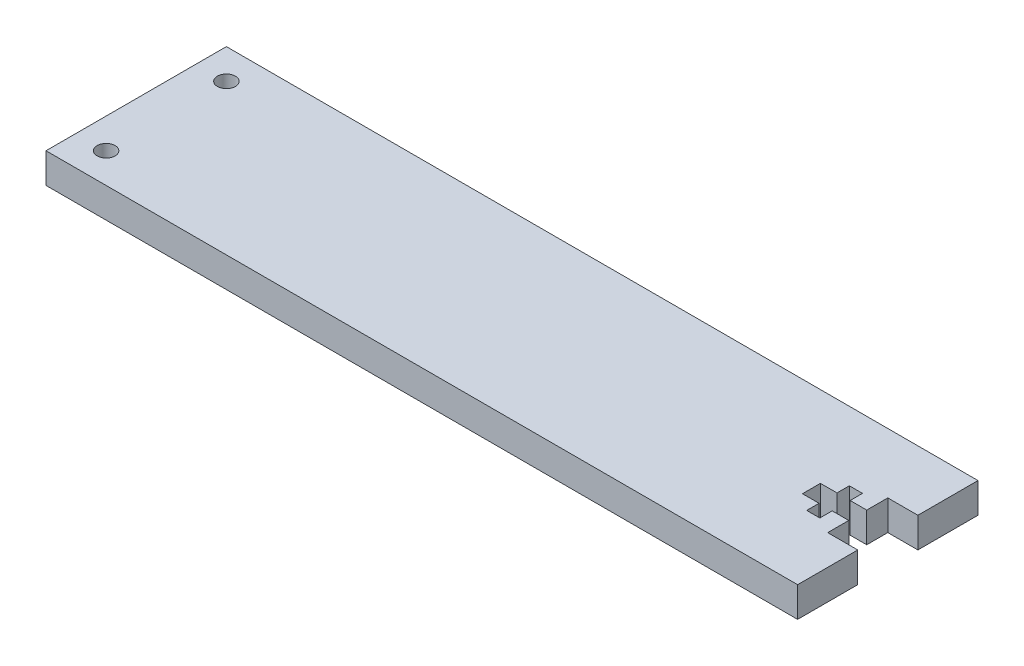
ISO-10303-21;
HEADER;
FILE_DESCRIPTION(('STEP AP214'),'2;1');
FILE_NAME('part.step','',(''),(''),'','','');
FILE_SCHEMA(('AUTOMOTIVE_DESIGN { 1 0 10303 214 1 1 1 1 }'));
ENDSEC;
DATA;
#1=APPLICATION_CONTEXT('core data for automotive mechanical design processes');
#2=APPLICATION_PROTOCOL_DEFINITION('international standard','automotive_design',2000,#1);
#3=PRODUCT_CONTEXT('',#1,'mechanical');
#4=PRODUCT('Part','Part','',(#3));
#5=PRODUCT_RELATED_PRODUCT_CATEGORY('part','',(#4));
#6=PRODUCT_DEFINITION_FORMATION('','',#4);
#7=PRODUCT_DEFINITION_CONTEXT('part definition',#1,'design');
#8=PRODUCT_DEFINITION('design','',#6,#7);
#9=PRODUCT_DEFINITION_SHAPE('','',#8);
#10=(LENGTH_UNIT() NAMED_UNIT(*) SI_UNIT(.MILLI.,.METRE.));
#11=(NAMED_UNIT(*) PLANE_ANGLE_UNIT() SI_UNIT($,.RADIAN.));
#12=(NAMED_UNIT(*) SI_UNIT($,.STERADIAN.) SOLID_ANGLE_UNIT());
#13=UNCERTAINTY_MEASURE_WITH_UNIT(LENGTH_MEASURE(1.E-05),#10,'distance_accuracy_value','');
#14=(GEOMETRIC_REPRESENTATION_CONTEXT(3) GLOBAL_UNCERTAINTY_ASSIGNED_CONTEXT((#13)) GLOBAL_UNIT_ASSIGNED_CONTEXT((#10,
#11,#12)) REPRESENTATION_CONTEXT('',''));
#15=CARTESIAN_POINT('',(0.,0.,0.));
#16=DIRECTION('',(0.,0.,1.));
#17=DIRECTION('',(1.,0.,0.));
#18=AXIS2_PLACEMENT_3D('',#15,#16,#17);
#19=CARTESIAN_POINT('',(0.,3.175,0.));
#20=DIRECTION('',(0.,-1.,0.));
#21=DIRECTION('',(0.,0.,-1.));
#22=AXIS2_PLACEMENT_3D('',#19,#20,#21);
#23=PLANE('',#22);
#24=CARTESIAN_POINT('',(-73.025,3.175,12.7));
#25=DIRECTION('',(0.,1.,0.));
#26=DIRECTION('',(0.,0.,1.));
#27=AXIS2_PLACEMENT_3D('',#24,#25,#26);
#28=CIRCLE('',#27,1.89864999999999);
#29=CARTESIAN_POINT('',(-73.025,3.175,14.59865));
#30=VERTEX_POINT('',#29);
#31=EDGE_CURVE('E600',#30,#30,#28,.T.);
#32=ORIENTED_EDGE('',*,*,#31,.F.);
#33=EDGE_LOOP('',(#32));
#34=FACE_BOUND('',#33,.T.);
#35=DIRECTION('',(0.,0.,-1.));
#36=VECTOR('',#35,1.);
#37=CARTESIAN_POINT('',(79.375,3.175,19.05));
#38=LINE('',#37,#36);
#39=CARTESIAN_POINT('',(79.375,3.175,19.05));
#40=VERTEX_POINT('',#39);
#41=CARTESIAN_POINT('',(79.375,3.175,6.35));
#42=VERTEX_POINT('',#41);
#43=EDGE_CURVE('E252',#40,#42,#38,.T.);
#44=ORIENTED_EDGE('',*,*,#43,.T.);
#45=DIRECTION('',(1.,0.,0.));
#46=VECTOR('',#45,1.);
#47=CARTESIAN_POINT('',(79.375,3.175,6.35));
#48=LINE('',#47,#46);
#49=CARTESIAN_POINT('',(73.025,3.175,6.35));
#50=VERTEX_POINT('',#49);
#51=EDGE_CURVE('E195',#50,#42,#48,.T.);
#52=ORIENTED_EDGE('',*,*,#51,.F.);
#53=DIRECTION('',(0.,0.,1.));
#54=VECTOR('',#53,1.);
#55=CARTESIAN_POINT('',(73.025,3.175,6.35));
#56=LINE('',#55,#54);
#57=CARTESIAN_POINT('',(73.025,3.175,1.89865));
#58=VERTEX_POINT('',#57);
#59=EDGE_CURVE('E200',#58,#50,#56,.T.);
#60=ORIENTED_EDGE('',*,*,#59,.F.);
#61=DIRECTION('',(1.,0.,0.));
#62=VECTOR('',#61,1.);
#63=CARTESIAN_POINT('',(73.025,3.175,1.89865));
#64=LINE('',#63,#62);
#65=CARTESIAN_POINT('',(69.524626,3.175,1.89865));
#66=VERTEX_POINT('',#65);
#67=EDGE_CURVE('E298',#66,#58,#64,.T.);
#68=ORIENTED_EDGE('',*,*,#67,.F.);
#69=DIRECTION('',(0.,0.,-1.));
#70=VECTOR('',#69,1.);
#71=CARTESIAN_POINT('',(69.524626,3.175,1.89865));
#72=LINE('',#71,#70);
#73=CARTESIAN_POINT('',(69.524626,3.175,4.50454662217654));
#74=VERTEX_POINT('',#73);
#75=EDGE_CURVE('E295',#74,#66,#72,.T.);
#76=ORIENTED_EDGE('',*,*,#75,.F.);
#77=DIRECTION('',(1.,0.,0.));
#78=VECTOR('',#77,1.);
#79=CARTESIAN_POINT('',(69.524626,3.175,4.50454662217654));
#80=LINE('',#79,#78);
#81=CARTESIAN_POINT('',(66.746374,3.175,4.50454662217654));
#82=VERTEX_POINT('',#81);
#83=EDGE_CURVE('E292',#82,#74,#80,.T.);
#84=ORIENTED_EDGE('',*,*,#83,.F.);
#85=DIRECTION('',(0.,0.,1.));
#86=VECTOR('',#85,1.);
#87=CARTESIAN_POINT('',(66.746374,3.175,4.50454662217654));
#88=LINE('',#87,#86);
#89=CARTESIAN_POINT('',(66.746374,3.175,1.89865));
#90=VERTEX_POINT('',#89);
#91=EDGE_CURVE('E289',#90,#82,#88,.T.);
#92=ORIENTED_EDGE('',*,*,#91,.F.);
#93=DIRECTION('',(1.,0.,0.));
#94=VECTOR('',#93,1.);
#95=CARTESIAN_POINT('',(66.746374,3.175,1.89865));
#96=LINE('',#95,#94);
#97=CARTESIAN_POINT('',(63.246,3.175,1.89865));
#98=VERTEX_POINT('',#97);
#99=EDGE_CURVE('E286',#98,#90,#96,.T.);
#100=ORIENTED_EDGE('',*,*,#99,.F.);
#101=DIRECTION('',(0.,0.,1.));
#102=VECTOR('',#101,1.);
#103=CARTESIAN_POINT('',(63.246,3.175,-1.89865));
#104=LINE('',#103,#102);
#105=CARTESIAN_POINT('',(63.246,3.175,-1.89865));
#106=VERTEX_POINT('',#105);
#107=EDGE_CURVE('E283',#106,#98,#104,.T.);
#108=ORIENTED_EDGE('',*,*,#107,.F.);
#109=DIRECTION('',(-1.,0.,0.));
#110=VECTOR('',#109,1.);
#111=CARTESIAN_POINT('',(66.746374,3.175,-1.89865));
#112=LINE('',#111,#110);
#113=CARTESIAN_POINT('',(66.746374,3.175,-1.89865));
#114=VERTEX_POINT('',#113);
#115=EDGE_CURVE('E280',#114,#106,#112,.T.);
#116=ORIENTED_EDGE('',*,*,#115,.F.);
#117=DIRECTION('',(0.,0.,1.));
#118=VECTOR('',#117,1.);
#119=CARTESIAN_POINT('',(66.746374,3.175,-4.50454662217654));
#120=LINE('',#119,#118);
#121=CARTESIAN_POINT('',(66.746374,3.175,-4.50454662217654));
#122=VERTEX_POINT('',#121);
#123=EDGE_CURVE('E277',#122,#114,#120,.T.);
#124=ORIENTED_EDGE('',*,*,#123,.F.);
#125=DIRECTION('',(-1.,0.,0.));
#126=VECTOR('',#125,1.);
#127=CARTESIAN_POINT('',(69.524626,3.175,-4.50454662217654));
#128=LINE('',#127,#126);
#129=CARTESIAN_POINT('',(69.524626,3.175,-4.50454662217654));
#130=VERTEX_POINT('',#129);
#131=EDGE_CURVE('E274',#130,#122,#128,.T.);
#132=ORIENTED_EDGE('',*,*,#131,.F.);
#133=DIRECTION('',(0.,0.,-1.));
#134=VECTOR('',#133,1.);
#135=CARTESIAN_POINT('',(69.524626,3.175,-1.89865));
#136=LINE('',#135,#134);
#137=CARTESIAN_POINT('',(69.524626,3.175,-1.89865));
#138=VERTEX_POINT('',#137);
#139=EDGE_CURVE('E271',#138,#130,#136,.T.);
#140=ORIENTED_EDGE('',*,*,#139,.F.);
#141=DIRECTION('',(-1.,0.,0.));
#142=VECTOR('',#141,1.);
#143=CARTESIAN_POINT('',(73.025,3.175,-1.89865));
#144=LINE('',#143,#142);
#145=CARTESIAN_POINT('',(73.025,3.175,-1.89865));
#146=VERTEX_POINT('',#145);
#147=EDGE_CURVE('E268',#146,#138,#144,.T.);
#148=ORIENTED_EDGE('',*,*,#147,.F.);
#149=DIRECTION('',(0.,0.,1.));
#150=VECTOR('',#149,1.);
#151=CARTESIAN_POINT('',(73.025,3.175,-1.89865));
#152=LINE('',#151,#150);
#153=CARTESIAN_POINT('',(73.025,3.175,-6.35));
#154=VERTEX_POINT('',#153);
#155=EDGE_CURVE('E262',#154,#146,#152,.T.);
#156=ORIENTED_EDGE('',*,*,#155,.F.);
#157=DIRECTION('',(-1.,0.,0.));
#158=VECTOR('',#157,1.);
#159=CARTESIAN_POINT('',(79.375,3.175,-6.35));
#160=LINE('',#159,#158);
#161=CARTESIAN_POINT('',(79.375,3.175,-6.35));
#162=VERTEX_POINT('',#161);
#163=EDGE_CURVE('E260',#162,#154,#160,.T.);
#164=ORIENTED_EDGE('',*,*,#163,.F.);
#165=CARTESIAN_POINT('',(79.375,3.175,-19.05));
#166=VERTEX_POINT('',#165);
#167=EDGE_CURVE('E93',#162,#166,#38,.T.);
#168=ORIENTED_EDGE('',*,*,#167,.T.);
#169=DIRECTION('',(-1.,0.,0.));
#170=VECTOR('',#169,1.);
#171=CARTESIAN_POINT('',(-79.375,3.175,-19.05));
#172=LINE('',#171,#170);
#173=CARTESIAN_POINT('',(-79.375,3.175,-19.05));
#174=VERTEX_POINT('',#173);
#175=EDGE_CURVE('E244',#166,#174,#172,.T.);
#176=ORIENTED_EDGE('',*,*,#175,.T.);
#177=DIRECTION('',(0.,0.,1.));
#178=VECTOR('',#177,1.);
#179=CARTESIAN_POINT('',(-79.375,3.175,19.05));
#180=LINE('',#179,#178);
#181=CARTESIAN_POINT('',(-79.375,3.175,19.05));
#182=VERTEX_POINT('',#181);
#183=EDGE_CURVE('E237',#174,#182,#180,.T.);
#184=ORIENTED_EDGE('',*,*,#183,.T.);
#185=DIRECTION('',(1.,0.,0.));
#186=VECTOR('',#185,1.);
#187=CARTESIAN_POINT('',(-79.375,3.175,19.05));
#188=LINE('',#187,#186);
#189=EDGE_CURVE('E63',#182,#40,#188,.T.);
#190=ORIENTED_EDGE('',*,*,#189,.T.);
#191=EDGE_LOOP('',(#44,#52,#60,#68,#76,#84,#92,#100,#108,#116,#124,#132,#140,#148,#156,#164,
#168,#176,#184,#190));
#192=FACE_BOUND('',#191,.T.);
#193=CARTESIAN_POINT('',(-73.025,3.175,-12.7));
#194=DIRECTION('',(0.,1.,0.));
#195=DIRECTION('',(0.,0.,1.));
#196=AXIS2_PLACEMENT_3D('',#193,#194,#195);
#197=CIRCLE('',#196,1.89864999999999);
#198=CARTESIAN_POINT('',(-73.025,3.175,-10.80135));
#199=VERTEX_POINT('',#198);
#200=EDGE_CURVE('E596',#199,#199,#197,.T.);
#201=ORIENTED_EDGE('',*,*,#200,.F.);
#202=EDGE_LOOP('',(#201));
#203=FACE_BOUND('',#202,.T.);
#204=ADVANCED_FACE('F39',(#34,#192,#203),#23,.F.);
#205=CARTESIAN_POINT('',(79.375,3.175,19.05));
#206=DIRECTION('',(-1.,0.,0.));
#207=DIRECTION('',(0.,0.,1.));
#208=AXIS2_PLACEMENT_3D('',#205,#206,#207);
#209=PLANE('',#208);
#210=DIRECTION('',(0.,0.,-1.));
#211=VECTOR('',#210,1.);
#212=CARTESIAN_POINT('',(79.375,-3.175,19.05));
#213=LINE('',#212,#211);
#214=CARTESIAN_POINT('',(79.375,-3.175,19.05));
#215=VERTEX_POINT('',#214);
#216=CARTESIAN_POINT('',(79.375,-3.175,6.35));
#217=VERTEX_POINT('',#216);
#218=EDGE_CURVE('E206',#215,#217,#213,.T.);
#219=ORIENTED_EDGE('',*,*,#218,.T.);
#220=DIRECTION('',(0.,1.,0.));
#221=VECTOR('',#220,1.);
#222=CARTESIAN_POINT('',(79.375,-3.176,6.35));
#223=LINE('',#222,#221);
#224=EDGE_CURVE('E189',#217,#42,#223,.T.);
#225=ORIENTED_EDGE('',*,*,#224,.T.);
#226=ORIENTED_EDGE('',*,*,#43,.F.);
#227=DIRECTION('',(0.,-1.,0.));
#228=VECTOR('',#227,1.);
#229=CARTESIAN_POINT('',(79.375,3.175,19.05));
#230=LINE('',#229,#228);
#231=EDGE_CURVE('E212',#40,#215,#230,.T.);
#232=ORIENTED_EDGE('',*,*,#231,.T.);
#233=EDGE_LOOP('',(#219,#225,#226,#232));
#234=FACE_BOUND('',#233,.T.);
#235=ADVANCED_FACE('F211',(#234),#209,.F.);
#236=ORIENTED_EDGE('',*,*,#167,.F.);
#237=DIRECTION('',(0.,1.,0.));
#238=VECTOR('',#237,1.);
#239=CARTESIAN_POINT('',(79.375,-3.176,-6.35));
#240=LINE('',#239,#238);
#241=CARTESIAN_POINT('',(79.375,-3.175,-6.35));
#242=VERTEX_POINT('',#241);
#243=EDGE_CURVE('E199',#242,#162,#240,.T.);
#244=ORIENTED_EDGE('',*,*,#243,.F.);
#245=CARTESIAN_POINT('',(79.375,-3.175,-19.05));
#246=VERTEX_POINT('',#245);
#247=EDGE_CURVE('E215',#242,#246,#213,.T.);
#248=ORIENTED_EDGE('',*,*,#247,.T.);
#249=DIRECTION('',(0.,-1.,0.));
#250=VECTOR('',#249,1.);
#251=CARTESIAN_POINT('',(79.375,3.175,-19.05));
#252=LINE('',#251,#250);
#253=EDGE_CURVE('E11',#166,#246,#252,.T.);
#254=ORIENTED_EDGE('',*,*,#253,.F.);
#255=EDGE_LOOP('',(#236,#244,#248,#254));
#256=FACE_BOUND('',#255,.T.);
#257=ADVANCED_FACE('F41',(#256),#209,.F.);
#258=CARTESIAN_POINT('',(-79.375,3.175,-19.05));
#259=DIRECTION('',(0.,0.,1.));
#260=DIRECTION('',(1.,0.,0.));
#261=AXIS2_PLACEMENT_3D('',#258,#259,#260);
#262=PLANE('',#261);
#263=DIRECTION('',(-1.,0.,0.));
#264=VECTOR('',#263,1.);
#265=CARTESIAN_POINT('',(-79.375,-3.175,-19.05));
#266=LINE('',#265,#264);
#267=CARTESIAN_POINT('',(-79.375,-3.175,-19.05));
#268=VERTEX_POINT('',#267);
#269=EDGE_CURVE('E214',#246,#268,#266,.T.);
#270=ORIENTED_EDGE('',*,*,#269,.T.);
#271=DIRECTION('',(0.,-1.,0.));
#272=VECTOR('',#271,1.);
#273=CARTESIAN_POINT('',(-79.375,3.175,-19.05));
#274=LINE('',#273,#272);
#275=EDGE_CURVE('E47',#174,#268,#274,.T.);
#276=ORIENTED_EDGE('',*,*,#275,.F.);
#277=ORIENTED_EDGE('',*,*,#175,.F.);
#278=ORIENTED_EDGE('',*,*,#253,.T.);
#279=EDGE_LOOP('',(#270,#276,#277,#278));
#280=FACE_BOUND('',#279,.T.);
#281=ADVANCED_FACE('F243',(#280),#262,.F.);
#282=CARTESIAN_POINT('',(-79.375,3.175,19.05));
#283=DIRECTION('',(1.,0.,0.));
#284=DIRECTION('',(0.,0.,-1.));
#285=AXIS2_PLACEMENT_3D('',#282,#283,#284);
#286=PLANE('',#285);
#287=DIRECTION('',(0.,0.,1.));
#288=VECTOR('',#287,1.);
#289=CARTESIAN_POINT('',(-79.375,-3.175,19.05));
#290=LINE('',#289,#288);
#291=CARTESIAN_POINT('',(-79.375,-3.175,19.05));
#292=VERTEX_POINT('',#291);
#293=EDGE_CURVE('E219',#268,#292,#290,.T.);
#294=ORIENTED_EDGE('',*,*,#293,.T.);
#295=DIRECTION('',(0.,-1.,0.));
#296=VECTOR('',#295,1.);
#297=CARTESIAN_POINT('',(-79.375,3.175,19.05));
#298=LINE('',#297,#296);
#299=EDGE_CURVE('E229',#182,#292,#298,.T.);
#300=ORIENTED_EDGE('',*,*,#299,.F.);
#301=ORIENTED_EDGE('',*,*,#183,.F.);
#302=ORIENTED_EDGE('',*,*,#275,.T.);
#303=EDGE_LOOP('',(#294,#300,#301,#302));
#304=FACE_BOUND('',#303,.T.);
#305=ADVANCED_FACE('F235',(#304),#286,.F.);
#306=CARTESIAN_POINT('',(-79.375,3.175,19.05));
#307=DIRECTION('',(0.,0.,-1.));
#308=DIRECTION('',(-1.,0.,0.));
#309=AXIS2_PLACEMENT_3D('',#306,#307,#308);
#310=PLANE('',#309);
#311=DIRECTION('',(1.,0.,0.));
#312=VECTOR('',#311,1.);
#313=CARTESIAN_POINT('',(-79.375,-3.175,19.05));
#314=LINE('',#313,#312);
#315=EDGE_CURVE('E86',#292,#215,#314,.T.);
#316=ORIENTED_EDGE('',*,*,#315,.T.);
#317=ORIENTED_EDGE('',*,*,#231,.F.);
#318=ORIENTED_EDGE('',*,*,#189,.F.);
#319=ORIENTED_EDGE('',*,*,#299,.T.);
#320=EDGE_LOOP('',(#316,#317,#318,#319));
#321=FACE_BOUND('',#320,.T.);
#322=ADVANCED_FACE('F256',(#321),#310,.F.);
#323=CARTESIAN_POINT('',(0.,-3.175,0.));
#324=DIRECTION('',(0.,-1.,0.));
#325=DIRECTION('',(0.,0.,-1.));
#326=AXIS2_PLACEMENT_3D('',#323,#324,#325);
#327=PLANE('',#326);
#328=CARTESIAN_POINT('',(-73.025,-3.175,-12.7));
#329=DIRECTION('',(0.,-1.,0.));
#330=DIRECTION('',(0.,0.,-1.));
#331=AXIS2_PLACEMENT_3D('',#328,#329,#330);
#332=CIRCLE('',#331,1.89864999999999);
#333=CARTESIAN_POINT('',(-73.025,-3.175,-14.59865));
#334=VERTEX_POINT('',#333);
#335=EDGE_CURVE('E599',#334,#334,#332,.T.);
#336=ORIENTED_EDGE('',*,*,#335,.F.);
#337=EDGE_LOOP('',(#336));
#338=FACE_BOUND('',#337,.T.);
#339=CARTESIAN_POINT('',(-73.025,-3.175,12.7));
#340=DIRECTION('',(0.,-1.,0.));
#341=DIRECTION('',(0.,0.,-1.));
#342=AXIS2_PLACEMENT_3D('',#339,#340,#341);
#343=CIRCLE('',#342,1.89864999999999);
#344=CARTESIAN_POINT('',(-73.025,-3.175,10.80135));
#345=VERTEX_POINT('',#344);
#346=EDGE_CURVE('E603',#345,#345,#343,.T.);
#347=ORIENTED_EDGE('',*,*,#346,.F.);
#348=EDGE_LOOP('',(#347));
#349=FACE_BOUND('',#348,.T.);
#350=DIRECTION('',(1.,0.,0.));
#351=VECTOR('',#350,1.);
#352=CARTESIAN_POINT('',(79.375,-3.175,6.35));
#353=LINE('',#352,#351);
#354=CARTESIAN_POINT('',(73.025,-3.175,6.35));
#355=VERTEX_POINT('',#354);
#356=EDGE_CURVE('E192',#355,#217,#353,.T.);
#357=ORIENTED_EDGE('',*,*,#356,.T.);
#358=ORIENTED_EDGE('',*,*,#218,.F.);
#359=ORIENTED_EDGE('',*,*,#315,.F.);
#360=ORIENTED_EDGE('',*,*,#293,.F.);
#361=ORIENTED_EDGE('',*,*,#269,.F.);
#362=ORIENTED_EDGE('',*,*,#247,.F.);
#363=DIRECTION('',(-1.,0.,0.));
#364=VECTOR('',#363,1.);
#365=CARTESIAN_POINT('',(79.375,-3.175,-6.35));
#366=LINE('',#365,#364);
#367=CARTESIAN_POINT('',(73.025,-3.175,-6.35));
#368=VERTEX_POINT('',#367);
#369=EDGE_CURVE('E350',#242,#368,#366,.T.);
#370=ORIENTED_EDGE('',*,*,#369,.T.);
#371=DIRECTION('',(0.,0.,1.));
#372=VECTOR('',#371,1.);
#373=CARTESIAN_POINT('',(73.025,-3.175,-1.89865));
#374=LINE('',#373,#372);
#375=CARTESIAN_POINT('',(73.025,-3.175,-1.89865));
#376=VERTEX_POINT('',#375);
#377=EDGE_CURVE('E346',#368,#376,#374,.T.);
#378=ORIENTED_EDGE('',*,*,#377,.T.);
#379=DIRECTION('',(-1.,0.,0.));
#380=VECTOR('',#379,1.);
#381=CARTESIAN_POINT('',(73.025,-3.175,-1.89865));
#382=LINE('',#381,#380);
#383=CARTESIAN_POINT('',(69.524626,-3.175,-1.89865));
#384=VERTEX_POINT('',#383);
#385=EDGE_CURVE('E333',#376,#384,#382,.T.);
#386=ORIENTED_EDGE('',*,*,#385,.T.);
#387=DIRECTION('',(0.,0.,-1.));
#388=VECTOR('',#387,1.);
#389=CARTESIAN_POINT('',(69.524626,-3.175,-1.89865));
#390=LINE('',#389,#388);
#391=CARTESIAN_POINT('',(69.524626,-3.175,-4.50454662217654));
#392=VERTEX_POINT('',#391);
#393=EDGE_CURVE('E344',#384,#392,#390,.T.);
#394=ORIENTED_EDGE('',*,*,#393,.T.);
#395=DIRECTION('',(-1.,0.,0.));
#396=VECTOR('',#395,1.);
#397=CARTESIAN_POINT('',(69.524626,-3.175,-4.50454662217654));
#398=LINE('',#397,#396);
#399=CARTESIAN_POINT('',(66.746374,-3.175,-4.50454662217654));
#400=VERTEX_POINT('',#399);
#401=EDGE_CURVE('E348',#392,#400,#398,.T.);
#402=ORIENTED_EDGE('',*,*,#401,.T.);
#403=DIRECTION('',(0.,0.,1.));
#404=VECTOR('',#403,1.);
#405=CARTESIAN_POINT('',(66.746374,-3.175,-4.50454662217654));
#406=LINE('',#405,#404);
#407=CARTESIAN_POINT('',(66.746374,-3.175,-1.89865));
#408=VERTEX_POINT('',#407);
#409=EDGE_CURVE('E355',#400,#408,#406,.T.);
#410=ORIENTED_EDGE('',*,*,#409,.T.);
#411=DIRECTION('',(-1.,0.,0.));
#412=VECTOR('',#411,1.);
#413=CARTESIAN_POINT('',(66.746374,-3.175,-1.89865));
#414=LINE('',#413,#412);
#415=CARTESIAN_POINT('',(63.246,-3.175,-1.89865));
#416=VERTEX_POINT('',#415);
#417=EDGE_CURVE('E358',#408,#416,#414,.T.);
#418=ORIENTED_EDGE('',*,*,#417,.T.);
#419=DIRECTION('',(0.,0.,1.));
#420=VECTOR('',#419,1.);
#421=CARTESIAN_POINT('',(63.246,-3.175,-1.89865));
#422=LINE('',#421,#420);
#423=CARTESIAN_POINT('',(63.246,-3.175,1.89865));
#424=VERTEX_POINT('',#423);
#425=EDGE_CURVE('E361',#416,#424,#422,.T.);
#426=ORIENTED_EDGE('',*,*,#425,.T.);
#427=DIRECTION('',(1.,0.,0.));
#428=VECTOR('',#427,1.);
#429=CARTESIAN_POINT('',(66.746374,-3.175,1.89865));
#430=LINE('',#429,#428);
#431=CARTESIAN_POINT('',(66.746374,-3.175,1.89865));
#432=VERTEX_POINT('',#431);
#433=EDGE_CURVE('E364',#424,#432,#430,.T.);
#434=ORIENTED_EDGE('',*,*,#433,.T.);
#435=DIRECTION('',(0.,0.,1.));
#436=VECTOR('',#435,1.);
#437=CARTESIAN_POINT('',(66.746374,-3.175,4.50454662217654));
#438=LINE('',#437,#436);
#439=CARTESIAN_POINT('',(66.746374,-3.175,4.50454662217654));
#440=VERTEX_POINT('',#439);
#441=EDGE_CURVE('E367',#432,#440,#438,.T.);
#442=ORIENTED_EDGE('',*,*,#441,.T.);
#443=DIRECTION('',(1.,0.,0.));
#444=VECTOR('',#443,1.);
#445=CARTESIAN_POINT('',(69.524626,-3.175,4.50454662217654));
#446=LINE('',#445,#444);
#447=CARTESIAN_POINT('',(69.524626,-3.175,4.50454662217654));
#448=VERTEX_POINT('',#447);
#449=EDGE_CURVE('E371',#440,#448,#446,.T.);
#450=ORIENTED_EDGE('',*,*,#449,.T.);
#451=DIRECTION('',(0.,0.,-1.));
#452=VECTOR('',#451,1.);
#453=CARTESIAN_POINT('',(69.524626,-3.175,1.89865));
#454=LINE('',#453,#452);
#455=CARTESIAN_POINT('',(69.524626,-3.175,1.89865));
#456=VERTEX_POINT('',#455);
#457=EDGE_CURVE('E375',#448,#456,#454,.T.);
#458=ORIENTED_EDGE('',*,*,#457,.T.);
#459=DIRECTION('',(1.,0.,0.));
#460=VECTOR('',#459,1.);
#461=CARTESIAN_POINT('',(73.025,-3.175,1.89865));
#462=LINE('',#461,#460);
#463=CARTESIAN_POINT('',(73.025,-3.175,1.89865));
#464=VERTEX_POINT('',#463);
#465=EDGE_CURVE('E379',#456,#464,#462,.T.);
#466=ORIENTED_EDGE('',*,*,#465,.T.);
#467=DIRECTION('',(0.,0.,1.));
#468=VECTOR('',#467,1.);
#469=CARTESIAN_POINT('',(73.025,-3.175,6.35));
#470=LINE('',#469,#468);
#471=EDGE_CURVE('E208',#464,#355,#470,.T.);
#472=ORIENTED_EDGE('',*,*,#471,.T.);
#473=EDGE_LOOP('',(#357,#358,#359,#360,#361,#362,#370,#378,#386,#394,#402,#410,#418,#426,#434,
#442,#450,#458,#466,#472));
#474=FACE_BOUND('',#473,.T.);
#475=ADVANCED_FACE('F205',(#338,#349,#474),#327,.T.);
#476=CARTESIAN_POINT('',(79.375,-3.176,6.35));
#477=DIRECTION('',(0.,0.,1.));
#478=DIRECTION('',(1.,0.,0.));
#479=AXIS2_PLACEMENT_3D('',#476,#477,#478);
#480=PLANE('',#479);
#481=DIRECTION('',(0.,1.,0.));
#482=VECTOR('',#481,1.);
#483=CARTESIAN_POINT('',(73.025,-3.176,6.35));
#484=LINE('',#483,#482);
#485=EDGE_CURVE('E221',#355,#50,#484,.T.);
#486=ORIENTED_EDGE('',*,*,#485,.T.);
#487=ORIENTED_EDGE('',*,*,#51,.T.);
#488=ORIENTED_EDGE('',*,*,#224,.F.);
#489=ORIENTED_EDGE('',*,*,#356,.F.);
#490=EDGE_LOOP('',(#486,#487,#488,#489));
#491=FACE_BOUND('',#490,.T.);
#492=ADVANCED_FACE('F191',(#491),#480,.F.);
#493=CARTESIAN_POINT('',(73.025,-3.176,6.35));
#494=DIRECTION('',(-1.,0.,0.));
#495=DIRECTION('',(0.,0.,1.));
#496=AXIS2_PLACEMENT_3D('',#493,#494,#495);
#497=PLANE('',#496);
#498=DIRECTION('',(0.,1.,0.));
#499=VECTOR('',#498,1.);
#500=CARTESIAN_POINT('',(73.025,-3.176,1.89865));
#501=LINE('',#500,#499);
#502=EDGE_CURVE('E304',#464,#58,#501,.T.);
#503=ORIENTED_EDGE('',*,*,#502,.T.);
#504=ORIENTED_EDGE('',*,*,#59,.T.);
#505=ORIENTED_EDGE('',*,*,#485,.F.);
#506=ORIENTED_EDGE('',*,*,#471,.F.);
#507=EDGE_LOOP('',(#503,#504,#505,#506));
#508=FACE_BOUND('',#507,.T.);
#509=ADVANCED_FACE('F480',(#508),#497,.F.);
#510=CARTESIAN_POINT('',(73.025,-3.176,1.89865));
#511=DIRECTION('',(0.,0.,1.));
#512=DIRECTION('',(1.,0.,0.));
#513=AXIS2_PLACEMENT_3D('',#510,#511,#512);
#514=PLANE('',#513);
#515=DIRECTION('',(0.,1.,0.));
#516=VECTOR('',#515,1.);
#517=CARTESIAN_POINT('',(69.524626,-3.176,1.89865));
#518=LINE('',#517,#516);
#519=EDGE_CURVE('E306',#456,#66,#518,.T.);
#520=ORIENTED_EDGE('',*,*,#519,.T.);
#521=ORIENTED_EDGE('',*,*,#67,.T.);
#522=ORIENTED_EDGE('',*,*,#502,.F.);
#523=ORIENTED_EDGE('',*,*,#465,.F.);
#524=EDGE_LOOP('',(#520,#521,#522,#523));
#525=FACE_BOUND('',#524,.T.);
#526=ADVANCED_FACE('F384',(#525),#514,.F.);
#527=CARTESIAN_POINT('',(69.524626,-3.176,1.89865));
#528=DIRECTION('',(1.,0.,0.));
#529=DIRECTION('',(0.,0.,-1.));
#530=AXIS2_PLACEMENT_3D('',#527,#528,#529);
#531=PLANE('',#530);
#532=DIRECTION('',(0.,1.,0.));
#533=VECTOR('',#532,1.);
#534=CARTESIAN_POINT('',(69.524626,-3.176,4.50454662217654));
#535=LINE('',#534,#533);
#536=EDGE_CURVE('E308',#448,#74,#535,.T.);
#537=ORIENTED_EDGE('',*,*,#536,.T.);
#538=ORIENTED_EDGE('',*,*,#75,.T.);
#539=ORIENTED_EDGE('',*,*,#519,.F.);
#540=ORIENTED_EDGE('',*,*,#457,.F.);
#541=EDGE_LOOP('',(#537,#538,#539,#540));
#542=FACE_BOUND('',#541,.T.);
#543=ADVANCED_FACE('F386',(#542),#531,.F.);
#544=CARTESIAN_POINT('',(69.524626,-3.176,4.50454662217654));
#545=DIRECTION('',(0.,0.,1.));
#546=DIRECTION('',(1.,0.,0.));
#547=AXIS2_PLACEMENT_3D('',#544,#545,#546);
#548=PLANE('',#547);
#549=DIRECTION('',(0.,1.,0.));
#550=VECTOR('',#549,1.);
#551=CARTESIAN_POINT('',(66.746374,-3.176,4.50454662217654));
#552=LINE('',#551,#550);
#553=EDGE_CURVE('E311',#440,#82,#552,.T.);
#554=ORIENTED_EDGE('',*,*,#553,.T.);
#555=ORIENTED_EDGE('',*,*,#83,.T.);
#556=ORIENTED_EDGE('',*,*,#536,.F.);
#557=ORIENTED_EDGE('',*,*,#449,.F.);
#558=EDGE_LOOP('',(#554,#555,#556,#557));
#559=FACE_BOUND('',#558,.T.);
#560=ADVANCED_FACE('F393',(#559),#548,.F.);
#561=CARTESIAN_POINT('',(66.746374,-3.176,4.50454662217654));
#562=DIRECTION('',(-1.,0.,0.));
#563=DIRECTION('',(0.,0.,1.));
#564=AXIS2_PLACEMENT_3D('',#561,#562,#563);
#565=PLANE('',#564);
#566=DIRECTION('',(0.,1.,0.));
#567=VECTOR('',#566,1.);
#568=CARTESIAN_POINT('',(66.746374,-3.176,1.89865));
#569=LINE('',#568,#567);
#570=EDGE_CURVE('E313',#432,#90,#569,.T.);
#571=ORIENTED_EDGE('',*,*,#570,.T.);
#572=ORIENTED_EDGE('',*,*,#91,.T.);
#573=ORIENTED_EDGE('',*,*,#553,.F.);
#574=ORIENTED_EDGE('',*,*,#441,.F.);
#575=EDGE_LOOP('',(#571,#572,#573,#574));
#576=FACE_BOUND('',#575,.T.);
#577=ADVANCED_FACE('F396',(#576),#565,.F.);
#578=CARTESIAN_POINT('',(66.746374,-3.176,1.89865));
#579=DIRECTION('',(0.,0.,1.));
#580=DIRECTION('',(1.,0.,0.));
#581=AXIS2_PLACEMENT_3D('',#578,#579,#580);
#582=PLANE('',#581);
#583=DIRECTION('',(0.,1.,0.));
#584=VECTOR('',#583,1.);
#585=CARTESIAN_POINT('',(63.246,-3.176,1.89865));
#586=LINE('',#585,#584);
#587=EDGE_CURVE('E315',#424,#98,#586,.T.);
#588=ORIENTED_EDGE('',*,*,#587,.T.);
#589=ORIENTED_EDGE('',*,*,#99,.T.);
#590=ORIENTED_EDGE('',*,*,#570,.F.);
#591=ORIENTED_EDGE('',*,*,#433,.F.);
#592=EDGE_LOOP('',(#588,#589,#590,#591));
#593=FACE_BOUND('',#592,.T.);
#594=ADVANCED_FACE('F399',(#593),#582,.F.);
#595=CARTESIAN_POINT('',(63.246,-3.176,-1.89865));
#596=DIRECTION('',(-1.,0.,0.));
#597=DIRECTION('',(0.,0.,1.));
#598=AXIS2_PLACEMENT_3D('',#595,#596,#597);
#599=PLANE('',#598);
#600=DIRECTION('',(0.,1.,0.));
#601=VECTOR('',#600,1.);
#602=CARTESIAN_POINT('',(63.246,-3.176,-1.89865));
#603=LINE('',#602,#601);
#604=EDGE_CURVE('E317',#416,#106,#603,.T.);
#605=ORIENTED_EDGE('',*,*,#604,.T.);
#606=ORIENTED_EDGE('',*,*,#107,.T.);
#607=ORIENTED_EDGE('',*,*,#587,.F.);
#608=ORIENTED_EDGE('',*,*,#425,.F.);
#609=EDGE_LOOP('',(#605,#606,#607,#608));
#610=FACE_BOUND('',#609,.T.);
#611=ADVANCED_FACE('F404',(#610),#599,.F.);
#612=CARTESIAN_POINT('',(66.746374,-3.176,-1.89865));
#613=DIRECTION('',(0.,0.,-1.));
#614=DIRECTION('',(-1.,0.,0.));
#615=AXIS2_PLACEMENT_3D('',#612,#613,#614);
#616=PLANE('',#615);
#617=DIRECTION('',(0.,1.,0.));
#618=VECTOR('',#617,1.);
#619=CARTESIAN_POINT('',(66.746374,-3.176,-1.89865));
#620=LINE('',#619,#618);
#621=EDGE_CURVE('E319',#408,#114,#620,.T.);
#622=ORIENTED_EDGE('',*,*,#621,.T.);
#623=ORIENTED_EDGE('',*,*,#115,.T.);
#624=ORIENTED_EDGE('',*,*,#604,.F.);
#625=ORIENTED_EDGE('',*,*,#417,.F.);
#626=EDGE_LOOP('',(#622,#623,#624,#625));
#627=FACE_BOUND('',#626,.T.);
#628=ADVANCED_FACE('F407',(#627),#616,.F.);
#629=CARTESIAN_POINT('',(66.746374,-3.176,-4.50454662217654));
#630=DIRECTION('',(-1.,0.,0.));
#631=DIRECTION('',(0.,0.,1.));
#632=AXIS2_PLACEMENT_3D('',#629,#630,#631);
#633=PLANE('',#632);
#634=DIRECTION('',(0.,1.,0.));
#635=VECTOR('',#634,1.);
#636=CARTESIAN_POINT('',(66.746374,-3.176,-4.50454662217654));
#637=LINE('',#636,#635);
#638=EDGE_CURVE('E321',#400,#122,#637,.T.);
#639=ORIENTED_EDGE('',*,*,#638,.T.);
#640=ORIENTED_EDGE('',*,*,#123,.T.);
#641=ORIENTED_EDGE('',*,*,#621,.F.);
#642=ORIENTED_EDGE('',*,*,#409,.F.);
#643=EDGE_LOOP('',(#639,#640,#641,#642));
#644=FACE_BOUND('',#643,.T.);
#645=ADVANCED_FACE('F410',(#644),#633,.F.);
#646=CARTESIAN_POINT('',(69.524626,-3.176,-4.50454662217654));
#647=DIRECTION('',(0.,0.,-1.));
#648=DIRECTION('',(-1.,0.,0.));
#649=AXIS2_PLACEMENT_3D('',#646,#647,#648);
#650=PLANE('',#649);
#651=DIRECTION('',(0.,1.,0.));
#652=VECTOR('',#651,1.);
#653=CARTESIAN_POINT('',(69.524626,-3.176,-4.50454662217654));
#654=LINE('',#653,#652);
#655=EDGE_CURVE('E323',#392,#130,#654,.T.);
#656=ORIENTED_EDGE('',*,*,#655,.T.);
#657=ORIENTED_EDGE('',*,*,#131,.T.);
#658=ORIENTED_EDGE('',*,*,#638,.F.);
#659=ORIENTED_EDGE('',*,*,#401,.F.);
#660=EDGE_LOOP('',(#656,#657,#658,#659));
#661=FACE_BOUND('',#660,.T.);
#662=ADVANCED_FACE('F413',(#661),#650,.F.);
#663=CARTESIAN_POINT('',(69.524626,-3.176,-1.89865));
#664=DIRECTION('',(1.,0.,0.));
#665=DIRECTION('',(0.,0.,-1.));
#666=AXIS2_PLACEMENT_3D('',#663,#664,#665);
#667=PLANE('',#666);
#668=DIRECTION('',(0.,1.,0.));
#669=VECTOR('',#668,1.);
#670=CARTESIAN_POINT('',(69.524626,-3.176,-1.89865));
#671=LINE('',#670,#669);
#672=EDGE_CURVE('E325',#384,#138,#671,.T.);
#673=ORIENTED_EDGE('',*,*,#672,.T.);
#674=ORIENTED_EDGE('',*,*,#139,.T.);
#675=ORIENTED_EDGE('',*,*,#655,.F.);
#676=ORIENTED_EDGE('',*,*,#393,.F.);
#677=EDGE_LOOP('',(#673,#674,#675,#676));
#678=FACE_BOUND('',#677,.T.);
#679=ADVANCED_FACE('F342',(#678),#667,.F.);
#680=CARTESIAN_POINT('',(73.025,-3.176,-1.89865));
#681=DIRECTION('',(0.,0.,-1.));
#682=DIRECTION('',(-1.,0.,0.));
#683=AXIS2_PLACEMENT_3D('',#680,#681,#682);
#684=PLANE('',#683);
#685=DIRECTION('',(0.,1.,0.));
#686=VECTOR('',#685,1.);
#687=CARTESIAN_POINT('',(73.025,-3.176,-1.89865));
#688=LINE('',#687,#686);
#689=EDGE_CURVE('E248',#376,#146,#688,.T.);
#690=ORIENTED_EDGE('',*,*,#689,.T.);
#691=ORIENTED_EDGE('',*,*,#147,.T.);
#692=ORIENTED_EDGE('',*,*,#672,.F.);
#693=ORIENTED_EDGE('',*,*,#385,.F.);
#694=EDGE_LOOP('',(#690,#691,#692,#693));
#695=FACE_BOUND('',#694,.T.);
#696=ADVANCED_FACE('F328',(#695),#684,.F.);
#697=CARTESIAN_POINT('',(73.025,-3.176,-1.89865));
#698=DIRECTION('',(-1.,0.,0.));
#699=DIRECTION('',(0.,0.,1.));
#700=AXIS2_PLACEMENT_3D('',#697,#698,#699);
#701=PLANE('',#700);
#702=DIRECTION('',(0.,1.,0.));
#703=VECTOR('',#702,1.);
#704=CARTESIAN_POINT('',(73.025,-3.176,-6.35));
#705=LINE('',#704,#703);
#706=EDGE_CURVE('E54',#368,#154,#705,.T.);
#707=ORIENTED_EDGE('',*,*,#706,.T.);
#708=ORIENTED_EDGE('',*,*,#155,.T.);
#709=ORIENTED_EDGE('',*,*,#689,.F.);
#710=ORIENTED_EDGE('',*,*,#377,.F.);
#711=EDGE_LOOP('',(#707,#708,#709,#710));
#712=FACE_BOUND('',#711,.T.);
#713=ADVANCED_FACE('F337',(#712),#701,.F.);
#714=CARTESIAN_POINT('',(79.375,-3.176,-6.35));
#715=DIRECTION('',(0.,0.,-1.));
#716=DIRECTION('',(-1.,0.,0.));
#717=AXIS2_PLACEMENT_3D('',#714,#715,#716);
#718=PLANE('',#717);
#719=ORIENTED_EDGE('',*,*,#243,.T.);
#720=ORIENTED_EDGE('',*,*,#163,.T.);
#721=ORIENTED_EDGE('',*,*,#706,.F.);
#722=ORIENTED_EDGE('',*,*,#369,.F.);
#723=EDGE_LOOP('',(#719,#720,#721,#722));
#724=FACE_BOUND('',#723,.T.);
#725=ADVANCED_FACE('F559',(#724),#718,.F.);
#726=CARTESIAN_POINT('',(-73.025,3.175,12.7));
#727=DIRECTION('',(0.,1.,0.));
#728=DIRECTION('',(0.,0.,1.));
#729=AXIS2_PLACEMENT_3D('',#726,#727,#728);
#730=CYLINDRICAL_SURFACE('',#729,1.89864999999999);
#731=ORIENTED_EDGE('',*,*,#31,.T.);
#732=EDGE_LOOP('',(#731));
#733=FACE_BOUND('',#732,.T.);
#734=ORIENTED_EDGE('',*,*,#346,.T.);
#735=EDGE_LOOP('',(#734));
#736=FACE_BOUND('',#735,.T.);
#737=ADVANCED_FACE('F568',(#733,#736),#730,.F.);
#738=CARTESIAN_POINT('',(-73.025,3.175,-12.7));
#739=DIRECTION('',(0.,1.,0.));
#740=DIRECTION('',(0.,0.,1.));
#741=AXIS2_PLACEMENT_3D('',#738,#739,#740);
#742=CYLINDRICAL_SURFACE('',#741,1.89864999999999);
#743=ORIENTED_EDGE('',*,*,#200,.T.);
#744=EDGE_LOOP('',(#743));
#745=FACE_BOUND('',#744,.T.);
#746=ORIENTED_EDGE('',*,*,#335,.T.);
#747=EDGE_LOOP('',(#746));
#748=FACE_BOUND('',#747,.T.);
#749=ADVANCED_FACE('F575',(#745,#748),#742,.F.);
#750=CLOSED_SHELL('',(#204,#235,#257,#281,#305,#322,#475,#492,#509,#526,#543,#560,#577,#594,
#611,#628,#645,#662,#679,#696,#713,#725,#737,#749));
#751=MANIFOLD_SOLID_BREP('B2',#750);
#752=ADVANCED_BREP_SHAPE_REPRESENTATION('',(#18,#751),#14);
#753=SHAPE_DEFINITION_REPRESENTATION(#9,#752);
ENDSEC;
END-ISO-10303-21;
